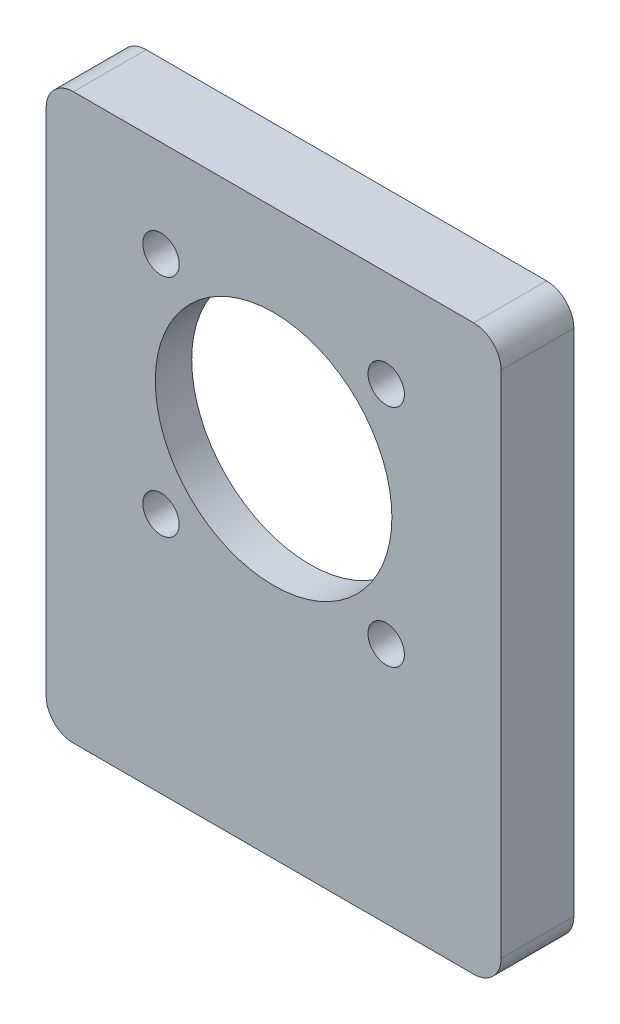
ISO-10303-21;
HEADER;
FILE_DESCRIPTION(('STEP AP214'),'2;1');
FILE_NAME('part.step','',(''),(''),'','','');
FILE_SCHEMA(('AUTOMOTIVE_DESIGN { 1 0 10303 214 1 1 1 1 }'));
ENDSEC;
DATA;
#1=APPLICATION_CONTEXT('core data for automotive mechanical design processes');
#2=APPLICATION_PROTOCOL_DEFINITION('international standard','automotive_design',2000,#1);
#3=PRODUCT_CONTEXT('',#1,'mechanical');
#4=PRODUCT('Part','Part','',(#3));
#5=PRODUCT_RELATED_PRODUCT_CATEGORY('part','',(#4));
#6=PRODUCT_DEFINITION_FORMATION('','',#4);
#7=PRODUCT_DEFINITION_CONTEXT('part definition',#1,'design');
#8=PRODUCT_DEFINITION('design','',#6,#7);
#9=PRODUCT_DEFINITION_SHAPE('','',#8);
#10=(LENGTH_UNIT() NAMED_UNIT(*) SI_UNIT(.MILLI.,.METRE.));
#11=(NAMED_UNIT(*) PLANE_ANGLE_UNIT() SI_UNIT($,.RADIAN.));
#12=(NAMED_UNIT(*) SI_UNIT($,.STERADIAN.) SOLID_ANGLE_UNIT());
#13=UNCERTAINTY_MEASURE_WITH_UNIT(LENGTH_MEASURE(1.E-05),#10,'distance_accuracy_value','');
#14=(GEOMETRIC_REPRESENTATION_CONTEXT(3) GLOBAL_UNCERTAINTY_ASSIGNED_CONTEXT((#13)) GLOBAL_UNIT_ASSIGNED_CONTEXT((#10,
#11,#12)) REPRESENTATION_CONTEXT('',''));
#15=CARTESIAN_POINT('',(0.,0.,0.));
#16=DIRECTION('',(0.,0.,1.));
#17=DIRECTION('',(1.,0.,0.));
#18=AXIS2_PLACEMENT_3D('',#15,#16,#17);
#19=CARTESIAN_POINT('',(0.,8.,0.));
#20=DIRECTION('',(0.,0.,1.));
#21=DIRECTION('',(1.,0.,0.));
#22=AXIS2_PLACEMENT_3D('',#19,#20,#21);
#23=CYLINDRICAL_SURFACE('',#22,13.);
#24=CARTESIAN_POINT('',(0.,8.,8.));
#25=DIRECTION('',(0.,0.,1.));
#26=DIRECTION('',(1.,0.,0.));
#27=AXIS2_PLACEMENT_3D('',#24,#25,#26);
#28=CIRCLE('',#27,13.);
#29=CARTESIAN_POINT('',(13.,8.,8.));
#30=VERTEX_POINT('',#29);
#31=EDGE_CURVE('E152',#30,#30,#28,.T.);
#32=ORIENTED_EDGE('',*,*,#31,.T.);
#33=EDGE_LOOP('',(#32));
#34=FACE_BOUND('',#33,.T.);
#35=CARTESIAN_POINT('',(0.,8.,4.));
#36=DIRECTION('',(0.,0.,-1.));
#37=DIRECTION('',(-1.,0.,0.));
#38=AXIS2_PLACEMENT_3D('',#35,#36,#37);
#39=CIRCLE('',#38,13.);
#40=CARTESIAN_POINT('',(-13.,8.,4.));
#41=VERTEX_POINT('',#40);
#42=EDGE_CURVE('E357',#41,#41,#39,.F.);
#43=ORIENTED_EDGE('',*,*,#42,.F.);
#44=EDGE_LOOP('',(#43));
#45=FACE_BOUND('',#44,.T.);
#46=ADVANCED_FACE('F51',(#34,#45),#23,.F.);
#47=CARTESIAN_POINT('',(12.3743686707647,20.3743686707644,0.));
#48=DIRECTION('',(0.,0.,1.));
#49=DIRECTION('',(1.,0.,0.));
#50=AXIS2_PLACEMENT_3D('',#47,#48,#49);
#51=CYLINDRICAL_SURFACE('',#50,2.00000000000001);
#52=CARTESIAN_POINT('',(12.3743686707647,20.3743686707644,8.));
#53=DIRECTION('',(0.,0.,1.));
#54=DIRECTION('',(1.,0.,0.));
#55=AXIS2_PLACEMENT_3D('',#52,#53,#54);
#56=CIRCLE('',#55,2.00000000000001);
#57=CARTESIAN_POINT('',(14.3743686707647,20.3743686707644,8.));
#58=VERTEX_POINT('',#57);
#59=EDGE_CURVE('E149',#58,#58,#56,.T.);
#60=ORIENTED_EDGE('',*,*,#59,.T.);
#61=EDGE_LOOP('',(#60));
#62=FACE_BOUND('',#61,.T.);
#63=CARTESIAN_POINT('',(12.3743686707647,20.3743686707644,4.));
#64=DIRECTION('',(0.,0.,-1.));
#65=DIRECTION('',(-1.,0.,0.));
#66=AXIS2_PLACEMENT_3D('',#63,#64,#65);
#67=CIRCLE('',#66,2.00000000000001);
#68=CARTESIAN_POINT('',(10.3743686707647,20.3743686707644,4.));
#69=VERTEX_POINT('',#68);
#70=EDGE_CURVE('E351',#69,#69,#67,.F.);
#71=ORIENTED_EDGE('',*,*,#70,.F.);
#72=EDGE_LOOP('',(#71));
#73=FACE_BOUND('',#72,.T.);
#74=ADVANCED_FACE('F237',(#62,#73),#51,.F.);
#75=CARTESIAN_POINT('',(12.3743686707646,-4.37436867076472,0.));
#76=DIRECTION('',(0.,0.,1.));
#77=DIRECTION('',(1.,0.,0.));
#78=AXIS2_PLACEMENT_3D('',#75,#76,#77);
#79=CYLINDRICAL_SURFACE('',#78,2.00000000000001);
#80=CARTESIAN_POINT('',(12.3743686707646,-4.37436867076472,8.));
#81=DIRECTION('',(0.,0.,1.));
#82=DIRECTION('',(1.,0.,0.));
#83=AXIS2_PLACEMENT_3D('',#80,#81,#82);
#84=CIRCLE('',#83,2.00000000000001);
#85=CARTESIAN_POINT('',(14.3743686707646,-4.37436867076472,8.));
#86=VERTEX_POINT('',#85);
#87=EDGE_CURVE('E153',#86,#86,#84,.T.);
#88=ORIENTED_EDGE('',*,*,#87,.T.);
#89=EDGE_LOOP('',(#88));
#90=FACE_BOUND('',#89,.T.);
#91=CARTESIAN_POINT('',(12.3743686707646,-4.37436867076472,4.));
#92=DIRECTION('',(0.,0.,-1.));
#93=DIRECTION('',(-1.,0.,0.));
#94=AXIS2_PLACEMENT_3D('',#91,#92,#93);
#95=CIRCLE('',#94,2.00000000000001);
#96=CARTESIAN_POINT('',(10.3743686707646,-4.37436867076472,4.));
#97=VERTEX_POINT('',#96);
#98=EDGE_CURVE('E348',#97,#97,#95,.F.);
#99=ORIENTED_EDGE('',*,*,#98,.F.);
#100=EDGE_LOOP('',(#99));
#101=FACE_BOUND('',#100,.T.);
#102=ADVANCED_FACE('F244',(#90,#101),#79,.F.);
#103=CARTESIAN_POINT('',(-12.3743686707646,-4.37436867076459,0.));
#104=DIRECTION('',(0.,0.,1.));
#105=DIRECTION('',(1.,0.,0.));
#106=AXIS2_PLACEMENT_3D('',#103,#104,#105);
#107=CYLINDRICAL_SURFACE('',#106,2.00000000000001);
#108=CARTESIAN_POINT('',(-12.3743686707646,-4.37436867076459,8.));
#109=DIRECTION('',(0.,0.,1.));
#110=DIRECTION('',(1.,0.,0.));
#111=AXIS2_PLACEMENT_3D('',#108,#109,#110);
#112=CIRCLE('',#111,2.00000000000001);
#113=CARTESIAN_POINT('',(-10.3743686707646,-4.37436867076459,8.));
#114=VERTEX_POINT('',#113);
#115=EDGE_CURVE('E156',#114,#114,#112,.T.);
#116=ORIENTED_EDGE('',*,*,#115,.T.);
#117=EDGE_LOOP('',(#116));
#118=FACE_BOUND('',#117,.T.);
#119=CARTESIAN_POINT('',(-12.3743686707646,-4.37436867076459,4.));
#120=DIRECTION('',(0.,0.,-1.));
#121=DIRECTION('',(-1.,0.,0.));
#122=AXIS2_PLACEMENT_3D('',#119,#120,#121);
#123=CIRCLE('',#122,2.00000000000001);
#124=CARTESIAN_POINT('',(-14.3743686707646,-4.37436867076459,4.));
#125=VERTEX_POINT('',#124);
#126=EDGE_CURVE('E220',#125,#125,#123,.F.);
#127=ORIENTED_EDGE('',*,*,#126,.F.);
#128=EDGE_LOOP('',(#127));
#129=FACE_BOUND('',#128,.T.);
#130=ADVANCED_FACE('F335',(#118,#129),#107,.F.);
#131=CARTESIAN_POINT('',(-12.3743686707645,20.3743686707646,0.));
#132=DIRECTION('',(0.,0.,1.));
#133=DIRECTION('',(1.,0.,0.));
#134=AXIS2_PLACEMENT_3D('',#131,#132,#133);
#135=CYLINDRICAL_SURFACE('',#134,2.00000000000001);
#136=CARTESIAN_POINT('',(-12.3743686707645,20.3743686707646,8.));
#137=DIRECTION('',(0.,0.,1.));
#138=DIRECTION('',(1.,0.,0.));
#139=AXIS2_PLACEMENT_3D('',#136,#137,#138);
#140=CIRCLE('',#139,2.00000000000001);
#141=CARTESIAN_POINT('',(-10.3743686707644,20.3743686707646,8.));
#142=VERTEX_POINT('',#141);
#143=EDGE_CURVE('E148',#142,#142,#140,.T.);
#144=ORIENTED_EDGE('',*,*,#143,.T.);
#145=EDGE_LOOP('',(#144));
#146=FACE_BOUND('',#145,.T.);
#147=CARTESIAN_POINT('',(-12.3743686707645,20.3743686707646,4.));
#148=DIRECTION('',(0.,0.,-1.));
#149=DIRECTION('',(-1.,0.,0.));
#150=AXIS2_PLACEMENT_3D('',#147,#148,#149);
#151=CIRCLE('',#150,2.00000000000001);
#152=CARTESIAN_POINT('',(-14.3743686707645,20.3743686707646,4.));
#153=VERTEX_POINT('',#152);
#154=EDGE_CURVE('E218',#153,#153,#151,.F.);
#155=ORIENTED_EDGE('',*,*,#154,.F.);
#156=EDGE_LOOP('',(#155));
#157=FACE_BOUND('',#156,.T.);
#158=ADVANCED_FACE('F250',(#146,#157),#135,.F.);
#159=CARTESIAN_POINT('',(25.,31.,8.));
#160=DIRECTION('',(-1.,0.,0.));
#161=DIRECTION('',(0.,-1.,0.));
#162=AXIS2_PLACEMENT_3D('',#159,#160,#161);
#163=PLANE('',#162);
#164=DIRECTION('',(0.,1.,0.));
#165=VECTOR('',#164,1.);
#166=CARTESIAN_POINT('',(25.,31.,8.));
#167=LINE('',#166,#165);
#168=CARTESIAN_POINT('',(25.,-28.,8.));
#169=VERTEX_POINT('',#168);
#170=CARTESIAN_POINT('',(25.,28.,8.));
#171=VERTEX_POINT('',#170);
#172=EDGE_CURVE('E164',#169,#171,#167,.T.);
#173=ORIENTED_EDGE('',*,*,#172,.F.);
#174=DIRECTION('',(0.,0.,-1.));
#175=VECTOR('',#174,1.);
#176=CARTESIAN_POINT('',(25.,-28.,8.));
#177=LINE('',#176,#175);
#178=CARTESIAN_POINT('',(25.,-28.,0.));
#179=VERTEX_POINT('',#178);
#180=EDGE_CURVE('E186',#169,#179,#177,.T.);
#181=ORIENTED_EDGE('',*,*,#180,.T.);
#182=DIRECTION('',(0.,1.,0.));
#183=VECTOR('',#182,1.);
#184=CARTESIAN_POINT('',(25.,31.,0.));
#185=LINE('',#184,#183);
#186=CARTESIAN_POINT('',(25.,28.,0.));
#187=VERTEX_POINT('',#186);
#188=EDGE_CURVE('E163',#179,#187,#185,.T.);
#189=ORIENTED_EDGE('',*,*,#188,.T.);
#190=DIRECTION('',(0.,0.,-1.));
#191=VECTOR('',#190,1.);
#192=CARTESIAN_POINT('',(25.,28.,8.));
#193=LINE('',#192,#191);
#194=EDGE_CURVE('E175',#187,#171,#193,.F.);
#195=ORIENTED_EDGE('',*,*,#194,.T.);
#196=EDGE_LOOP('',(#173,#181,#189,#195));
#197=FACE_BOUND('',#196,.T.);
#198=ADVANCED_FACE('F271',(#197),#163,.F.);
#199=CARTESIAN_POINT('',(-25.,31.,8.));
#200=DIRECTION('',(0.,-1.,0.));
#201=DIRECTION('',(0.,0.,-1.));
#202=AXIS2_PLACEMENT_3D('',#199,#200,#201);
#203=PLANE('',#202);
#204=DIRECTION('',(-1.,0.,0.));
#205=VECTOR('',#204,1.);
#206=CARTESIAN_POINT('',(-25.,31.,0.));
#207=LINE('',#206,#205);
#208=CARTESIAN_POINT('',(22.,31.,0.));
#209=VERTEX_POINT('',#208);
#210=CARTESIAN_POINT('',(-22.,31.,0.));
#211=VERTEX_POINT('',#210);
#212=EDGE_CURVE('E178',#209,#211,#207,.T.);
#213=ORIENTED_EDGE('',*,*,#212,.T.);
#214=DIRECTION('',(0.,0.,-1.));
#215=VECTOR('',#214,1.);
#216=CARTESIAN_POINT('',(-22.,31.,8.));
#217=LINE('',#216,#215);
#218=CARTESIAN_POINT('',(-22.,31.,8.));
#219=VERTEX_POINT('',#218);
#220=EDGE_CURVE('E216',#211,#219,#217,.F.);
#221=ORIENTED_EDGE('',*,*,#220,.T.);
#222=DIRECTION('',(-1.,0.,0.));
#223=VECTOR('',#222,1.);
#224=CARTESIAN_POINT('',(-25.,31.,8.));
#225=LINE('',#224,#223);
#226=CARTESIAN_POINT('',(22.,31.,8.));
#227=VERTEX_POINT('',#226);
#228=EDGE_CURVE('E167',#227,#219,#225,.T.);
#229=ORIENTED_EDGE('',*,*,#228,.F.);
#230=DIRECTION('',(0.,0.,-1.));
#231=VECTOR('',#230,1.);
#232=CARTESIAN_POINT('',(22.,31.,8.));
#233=LINE('',#232,#231);
#234=EDGE_CURVE('E213',#227,#209,#233,.T.);
#235=ORIENTED_EDGE('',*,*,#234,.T.);
#236=EDGE_LOOP('',(#213,#221,#229,#235));
#237=FACE_BOUND('',#236,.T.);
#238=ADVANCED_FACE('F268',(#237),#203,.F.);
#239=CARTESIAN_POINT('',(-25.,31.,8.));
#240=DIRECTION('',(1.,0.,0.));
#241=DIRECTION('',(0.,1.,0.));
#242=AXIS2_PLACEMENT_3D('',#239,#240,#241);
#243=PLANE('',#242);
#244=DIRECTION('',(0.,-1.,0.));
#245=VECTOR('',#244,1.);
#246=CARTESIAN_POINT('',(-25.,31.,8.));
#247=LINE('',#246,#245);
#248=CARTESIAN_POINT('',(-25.,28.,8.));
#249=VERTEX_POINT('',#248);
#250=CARTESIAN_POINT('',(-25.,-28.,8.));
#251=VERTEX_POINT('',#250);
#252=EDGE_CURVE('E170',#249,#251,#247,.T.);
#253=ORIENTED_EDGE('',*,*,#252,.F.);
#254=DIRECTION('',(0.,0.,-1.));
#255=VECTOR('',#254,1.);
#256=CARTESIAN_POINT('',(-25.,28.,8.));
#257=LINE('',#256,#255);
#258=CARTESIAN_POINT('',(-25.,28.,0.));
#259=VERTEX_POINT('',#258);
#260=EDGE_CURVE('E210',#249,#259,#257,.T.);
#261=ORIENTED_EDGE('',*,*,#260,.T.);
#262=DIRECTION('',(0.,-1.,0.));
#263=VECTOR('',#262,1.);
#264=CARTESIAN_POINT('',(-25.,31.,0.));
#265=LINE('',#264,#263);
#266=CARTESIAN_POINT('',(-25.,-28.,0.));
#267=VERTEX_POINT('',#266);
#268=EDGE_CURVE('E181',#259,#267,#265,.T.);
#269=ORIENTED_EDGE('',*,*,#268,.T.);
#270=DIRECTION('',(0.,0.,-1.));
#271=VECTOR('',#270,1.);
#272=CARTESIAN_POINT('',(-25.,-28.,8.));
#273=LINE('',#272,#271);
#274=EDGE_CURVE('E66',#267,#251,#273,.F.);
#275=ORIENTED_EDGE('',*,*,#274,.T.);
#276=EDGE_LOOP('',(#253,#261,#269,#275));
#277=FACE_BOUND('',#276,.T.);
#278=ADVANCED_FACE('F264',(#277),#243,.F.);
#279=CARTESIAN_POINT('',(-25.,-31.,8.));
#280=DIRECTION('',(0.,1.,0.));
#281=DIRECTION('',(0.,0.,1.));
#282=AXIS2_PLACEMENT_3D('',#279,#280,#281);
#283=PLANE('',#282);
#284=CARTESIAN_POINT('',(-15.,-31.,3.99999999999999));
#285=DIRECTION('',(0.,-1.,0.));
#286=DIRECTION('',(0.,0.,-1.));
#287=AXIS2_PLACEMENT_3D('',#284,#285,#286);
#288=CIRCLE('',#287,2.525);
#289=CARTESIAN_POINT('',(-15.,-31.,1.475));
#290=VERTEX_POINT('',#289);
#291=EDGE_CURVE('E139',#290,#290,#288,.T.);
#292=ORIENTED_EDGE('',*,*,#291,.F.);
#293=EDGE_LOOP('',(#292));
#294=FACE_BOUND('',#293,.T.);
#295=CARTESIAN_POINT('',(15.,-31.,4.));
#296=DIRECTION('',(0.,-1.,0.));
#297=DIRECTION('',(0.,0.,-1.));
#298=AXIS2_PLACEMENT_3D('',#295,#296,#297);
#299=CIRCLE('',#298,2.525);
#300=CARTESIAN_POINT('',(15.,-31.,1.475));
#301=VERTEX_POINT('',#300);
#302=EDGE_CURVE('E132',#301,#301,#299,.T.);
#303=ORIENTED_EDGE('',*,*,#302,.F.);
#304=EDGE_LOOP('',(#303));
#305=FACE_BOUND('',#304,.T.);
#306=DIRECTION('',(1.,0.,0.));
#307=VECTOR('',#306,1.);
#308=CARTESIAN_POINT('',(-25.,-31.,0.));
#309=LINE('',#308,#307);
#310=CARTESIAN_POINT('',(-22.,-31.,0.));
#311=VERTEX_POINT('',#310);
#312=CARTESIAN_POINT('',(22.,-31.,0.));
#313=VERTEX_POINT('',#312);
#314=EDGE_CURVE('E168',#311,#313,#309,.T.);
#315=ORIENTED_EDGE('',*,*,#314,.T.);
#316=DIRECTION('',(0.,0.,-1.));
#317=VECTOR('',#316,1.);
#318=CARTESIAN_POINT('',(22.,-31.,8.));
#319=LINE('',#318,#317);
#320=CARTESIAN_POINT('',(22.,-31.,8.));
#321=VERTEX_POINT('',#320);
#322=EDGE_CURVE('E200',#313,#321,#319,.F.);
#323=ORIENTED_EDGE('',*,*,#322,.T.);
#324=DIRECTION('',(1.,0.,0.));
#325=VECTOR('',#324,1.);
#326=CARTESIAN_POINT('',(-25.,-31.,8.));
#327=LINE('',#326,#325);
#328=CARTESIAN_POINT('',(-22.,-31.,8.));
#329=VERTEX_POINT('',#328);
#330=EDGE_CURVE('E172',#329,#321,#327,.T.);
#331=ORIENTED_EDGE('',*,*,#330,.F.);
#332=DIRECTION('',(0.,0.,-1.));
#333=VECTOR('',#332,1.);
#334=CARTESIAN_POINT('',(-22.,-31.,8.));
#335=LINE('',#334,#333);
#336=EDGE_CURVE('E197',#329,#311,#335,.T.);
#337=ORIENTED_EDGE('',*,*,#336,.T.);
#338=EDGE_LOOP('',(#315,#323,#331,#337));
#339=FACE_BOUND('',#338,.T.);
#340=ADVANCED_FACE('F256',(#294,#305,#339),#283,.F.);
#341=CARTESIAN_POINT('',(0.,0.,8.));
#342=DIRECTION('',(0.,0.,1.));
#343=DIRECTION('',(1.,0.,0.));
#344=AXIS2_PLACEMENT_3D('',#341,#342,#343);
#345=PLANE('',#344);
#346=ORIENTED_EDGE('',*,*,#143,.F.);
#347=EDGE_LOOP('',(#346));
#348=FACE_BOUND('',#347,.T.);
#349=ORIENTED_EDGE('',*,*,#115,.F.);
#350=EDGE_LOOP('',(#349));
#351=FACE_BOUND('',#350,.T.);
#352=ORIENTED_EDGE('',*,*,#87,.F.);
#353=EDGE_LOOP('',(#352));
#354=FACE_BOUND('',#353,.T.);
#355=ORIENTED_EDGE('',*,*,#59,.F.);
#356=EDGE_LOOP('',(#355));
#357=FACE_BOUND('',#356,.T.);
#358=ORIENTED_EDGE('',*,*,#31,.F.);
#359=EDGE_LOOP('',(#358));
#360=FACE_BOUND('',#359,.T.);
#361=ORIENTED_EDGE('',*,*,#330,.T.);
#362=CARTESIAN_POINT('',(22.,-28.,8.));
#363=DIRECTION('',(0.,0.,1.));
#364=DIRECTION('',(1.,0.,0.));
#365=AXIS2_PLACEMENT_3D('',#362,#363,#364);
#366=CIRCLE('',#365,3.);
#367=EDGE_CURVE('E207',#321,#169,#366,.T.);
#368=ORIENTED_EDGE('',*,*,#367,.T.);
#369=ORIENTED_EDGE('',*,*,#172,.T.);
#370=CARTESIAN_POINT('',(22.,28.,8.));
#371=DIRECTION('',(0.,0.,1.));
#372=DIRECTION('',(1.,0.,0.));
#373=AXIS2_PLACEMENT_3D('',#370,#371,#372);
#374=CIRCLE('',#373,3.);
#375=EDGE_CURVE('E204',#171,#227,#374,.T.);
#376=ORIENTED_EDGE('',*,*,#375,.T.);
#377=ORIENTED_EDGE('',*,*,#228,.T.);
#378=CARTESIAN_POINT('',(-22.,28.,8.));
#379=DIRECTION('',(0.,0.,1.));
#380=DIRECTION('',(1.,0.,0.));
#381=AXIS2_PLACEMENT_3D('',#378,#379,#380);
#382=CIRCLE('',#381,3.);
#383=EDGE_CURVE('E73',#219,#249,#382,.T.);
#384=ORIENTED_EDGE('',*,*,#383,.T.);
#385=ORIENTED_EDGE('',*,*,#252,.T.);
#386=CARTESIAN_POINT('',(-22.,-28.,8.));
#387=DIRECTION('',(0.,0.,1.));
#388=DIRECTION('',(1.,0.,0.));
#389=AXIS2_PLACEMENT_3D('',#386,#387,#388);
#390=CIRCLE('',#389,3.);
#391=EDGE_CURVE('E202',#251,#329,#390,.T.);
#392=ORIENTED_EDGE('',*,*,#391,.T.);
#393=EDGE_LOOP('',(#361,#368,#369,#376,#377,#384,#385,#392));
#394=FACE_BOUND('',#393,.T.);
#395=ADVANCED_FACE('F252',(#348,#351,#354,#357,#360,#394),#345,.T.);
#396=CARTESIAN_POINT('',(0.,0.,0.));
#397=DIRECTION('',(0.,0.,1.));
#398=DIRECTION('',(1.,0.,0.));
#399=AXIS2_PLACEMENT_3D('',#396,#397,#398);
#400=PLANE('',#399);
#401=CARTESIAN_POINT('',(0.,8.,0.));
#402=DIRECTION('',(0.,0.,1.));
#403=DIRECTION('',(1.,0.,0.));
#404=AXIS2_PLACEMENT_3D('',#401,#402,#403);
#405=CIRCLE('',#404,21.75);
#406=CARTESIAN_POINT('',(21.75,8.,0.));
#407=VERTEX_POINT('',#406);
#408=EDGE_CURVE('E13',#407,#407,#405,.T.);
#409=ORIENTED_EDGE('',*,*,#408,.T.);
#410=EDGE_LOOP('',(#409));
#411=FACE_BOUND('',#410,.T.);
#412=ORIENTED_EDGE('',*,*,#188,.F.);
#413=CARTESIAN_POINT('',(22.,-28.,0.));
#414=DIRECTION('',(0.,0.,1.));
#415=DIRECTION('',(1.,0.,0.));
#416=AXIS2_PLACEMENT_3D('',#413,#414,#415);
#417=CIRCLE('',#416,3.);
#418=EDGE_CURVE('E195',#179,#313,#417,.F.);
#419=ORIENTED_EDGE('',*,*,#418,.T.);
#420=ORIENTED_EDGE('',*,*,#314,.F.);
#421=CARTESIAN_POINT('',(-22.,-28.,0.));
#422=DIRECTION('',(0.,0.,1.));
#423=DIRECTION('',(1.,0.,0.));
#424=AXIS2_PLACEMENT_3D('',#421,#422,#423);
#425=CIRCLE('',#424,3.);
#426=EDGE_CURVE('E189',#311,#267,#425,.F.);
#427=ORIENTED_EDGE('',*,*,#426,.T.);
#428=ORIENTED_EDGE('',*,*,#268,.F.);
#429=CARTESIAN_POINT('',(-22.,28.,0.));
#430=DIRECTION('',(0.,0.,1.));
#431=DIRECTION('',(1.,0.,0.));
#432=AXIS2_PLACEMENT_3D('',#429,#430,#431);
#433=CIRCLE('',#432,3.);
#434=EDGE_CURVE('E193',#259,#211,#433,.F.);
#435=ORIENTED_EDGE('',*,*,#434,.T.);
#436=ORIENTED_EDGE('',*,*,#212,.F.);
#437=CARTESIAN_POINT('',(22.,28.,0.));
#438=DIRECTION('',(0.,0.,1.));
#439=DIRECTION('',(1.,0.,0.));
#440=AXIS2_PLACEMENT_3D('',#437,#438,#439);
#441=CIRCLE('',#440,3.);
#442=EDGE_CURVE('E191',#209,#187,#441,.F.);
#443=ORIENTED_EDGE('',*,*,#442,.T.);
#444=EDGE_LOOP('',(#412,#419,#420,#427,#428,#435,#436,#443));
#445=FACE_BOUND('',#444,.T.);
#446=ADVANCED_FACE('F255',(#411,#445),#400,.F.);
#447=CARTESIAN_POINT('',(15.,-16.,4.));
#448=DIRECTION('',(0.,-1.,0.));
#449=DIRECTION('',(0.,0.,-1.));
#450=AXIS2_PLACEMENT_3D('',#447,#448,#449);
#451=CONICAL_SURFACE('',#450,2.1,1.02974425867665);
#452=CARTESIAN_POINT('',(15.,-14.7381927000421,4.));
#453=VERTEX_POINT('',#452);
#454=VERTEX_LOOP('',#453);
#455=FACE_BOUND('',#454,.T.);
#456=CARTESIAN_POINT('',(15.,-16.,4.));
#457=DIRECTION('',(0.,-1.,0.));
#458=DIRECTION('',(0.,0.,-1.));
#459=AXIS2_PLACEMENT_3D('',#456,#457,#458);
#460=CIRCLE('',#459,2.1);
#461=CARTESIAN_POINT('',(15.,-16.,1.90000000000001));
#462=VERTEX_POINT('',#461);
#463=EDGE_CURVE('E145',#462,#462,#460,.T.);
#464=ORIENTED_EDGE('',*,*,#463,.T.);
#465=EDGE_LOOP('',(#464));
#466=FACE_BOUND('',#465,.T.);
#467=ADVANCED_FACE('F260',(#455,#466),#451,.F.);
#468=CARTESIAN_POINT('',(15.,-31.,4.));
#469=DIRECTION('',(0.,-1.,0.));
#470=DIRECTION('',(0.,0.,-1.));
#471=AXIS2_PLACEMENT_3D('',#468,#469,#470);
#472=CYLINDRICAL_SURFACE('',#471,2.1);
#473=ORIENTED_EDGE('',*,*,#463,.F.);
#474=EDGE_LOOP('',(#473));
#475=FACE_BOUND('',#474,.T.);
#476=CARTESIAN_POINT('',(15.,-30.575,4.));
#477=DIRECTION('',(0.,-1.,0.));
#478=DIRECTION('',(0.,0.,-1.));
#479=AXIS2_PLACEMENT_3D('',#476,#477,#478);
#480=CIRCLE('',#479,2.1);
#481=CARTESIAN_POINT('',(15.,-30.575,1.9));
#482=VERTEX_POINT('',#481);
#483=EDGE_CURVE('E136',#482,#482,#480,.T.);
#484=ORIENTED_EDGE('',*,*,#483,.T.);
#485=EDGE_LOOP('',(#484));
#486=FACE_BOUND('',#485,.T.);
#487=ADVANCED_FACE('F326',(#475,#486),#472,.F.);
#488=CARTESIAN_POINT('',(15.,-31.,4.));
#489=DIRECTION('',(0.,-1.,0.));
#490=DIRECTION('',(0.,0.,-1.));
#491=AXIS2_PLACEMENT_3D('',#488,#489,#490);
#492=CONICAL_SURFACE('',#491,2.525,0.785398163397448);
#493=ORIENTED_EDGE('',*,*,#483,.F.);
#494=EDGE_LOOP('',(#493));
#495=FACE_BOUND('',#494,.T.);
#496=ORIENTED_EDGE('',*,*,#302,.T.);
#497=EDGE_LOOP('',(#496));
#498=FACE_BOUND('',#497,.T.);
#499=ADVANCED_FACE('F126',(#495,#498),#492,.F.);
#500=CARTESIAN_POINT('',(-15.,-16.,3.99999999999999));
#501=DIRECTION('',(0.,-1.,0.));
#502=DIRECTION('',(0.,0.,-1.));
#503=AXIS2_PLACEMENT_3D('',#500,#501,#502);
#504=CONICAL_SURFACE('',#503,2.1,1.02974425867665);
#505=CARTESIAN_POINT('',(-15.,-14.7381927000421,3.99999999999999));
#506=VERTEX_POINT('',#505);
#507=VERTEX_LOOP('',#506);
#508=FACE_BOUND('',#507,.T.);
#509=CARTESIAN_POINT('',(-15.,-16.,3.99999999999999));
#510=DIRECTION('',(0.,-1.,0.));
#511=DIRECTION('',(0.,0.,-1.));
#512=AXIS2_PLACEMENT_3D('',#509,#510,#511);
#513=CIRCLE('',#512,2.1);
#514=CARTESIAN_POINT('',(-15.,-16.,1.9));
#515=VERTEX_POINT('',#514);
#516=EDGE_CURVE('E130',#515,#515,#513,.T.);
#517=ORIENTED_EDGE('',*,*,#516,.T.);
#518=EDGE_LOOP('',(#517));
#519=FACE_BOUND('',#518,.T.);
#520=ADVANCED_FACE('F122',(#508,#519),#504,.F.);
#521=CARTESIAN_POINT('',(-15.,-31.,3.99999999999999));
#522=DIRECTION('',(0.,-1.,0.));
#523=DIRECTION('',(0.,0.,-1.));
#524=AXIS2_PLACEMENT_3D('',#521,#522,#523);
#525=CYLINDRICAL_SURFACE('',#524,2.1);
#526=ORIENTED_EDGE('',*,*,#516,.F.);
#527=EDGE_LOOP('',(#526));
#528=FACE_BOUND('',#527,.T.);
#529=CARTESIAN_POINT('',(-15.,-30.575,3.99999999999999));
#530=DIRECTION('',(0.,-1.,0.));
#531=DIRECTION('',(0.,0.,-1.));
#532=AXIS2_PLACEMENT_3D('',#529,#530,#531);
#533=CIRCLE('',#532,2.1);
#534=CARTESIAN_POINT('',(-15.,-30.575,1.9));
#535=VERTEX_POINT('',#534);
#536=EDGE_CURVE('E133',#535,#535,#533,.T.);
#537=ORIENTED_EDGE('',*,*,#536,.T.);
#538=EDGE_LOOP('',(#537));
#539=FACE_BOUND('',#538,.T.);
#540=ADVANCED_FACE('F125',(#528,#539),#525,.F.);
#541=CARTESIAN_POINT('',(-15.,-31.,3.99999999999999));
#542=DIRECTION('',(0.,-1.,0.));
#543=DIRECTION('',(0.,0.,-1.));
#544=AXIS2_PLACEMENT_3D('',#541,#542,#543);
#545=CONICAL_SURFACE('',#544,2.525,0.785398163397446);
#546=ORIENTED_EDGE('',*,*,#536,.F.);
#547=EDGE_LOOP('',(#546));
#548=FACE_BOUND('',#547,.T.);
#549=ORIENTED_EDGE('',*,*,#291,.T.);
#550=EDGE_LOOP('',(#549));
#551=FACE_BOUND('',#550,.T.);
#552=ADVANCED_FACE('F280',(#548,#551),#545,.F.);
#553=CARTESIAN_POINT('',(22.,-28.,8.));
#554=DIRECTION('',(0.,0.,-1.));
#555=DIRECTION('',(-1.,0.,0.));
#556=AXIS2_PLACEMENT_3D('',#553,#554,#555);
#557=CYLINDRICAL_SURFACE('',#556,3.);
#558=ORIENTED_EDGE('',*,*,#367,.F.);
#559=ORIENTED_EDGE('',*,*,#322,.F.);
#560=ORIENTED_EDGE('',*,*,#418,.F.);
#561=ORIENTED_EDGE('',*,*,#180,.F.);
#562=EDGE_LOOP('',(#558,#559,#560,#561));
#563=FACE_BOUND('',#562,.T.);
#564=ADVANCED_FACE('F276',(#563),#557,.T.);
#565=CARTESIAN_POINT('',(-22.,28.,8.));
#566=DIRECTION('',(0.,0.,-1.));
#567=DIRECTION('',(-1.,0.,0.));
#568=AXIS2_PLACEMENT_3D('',#565,#566,#567);
#569=CYLINDRICAL_SURFACE('',#568,3.);
#570=ORIENTED_EDGE('',*,*,#383,.F.);
#571=ORIENTED_EDGE('',*,*,#220,.F.);
#572=ORIENTED_EDGE('',*,*,#434,.F.);
#573=ORIENTED_EDGE('',*,*,#260,.F.);
#574=EDGE_LOOP('',(#570,#571,#572,#573));
#575=FACE_BOUND('',#574,.T.);
#576=ADVANCED_FACE('F279',(#575),#569,.T.);
#577=CARTESIAN_POINT('',(22.,28.,8.));
#578=DIRECTION('',(0.,0.,-1.));
#579=DIRECTION('',(-1.,0.,0.));
#580=AXIS2_PLACEMENT_3D('',#577,#578,#579);
#581=CYLINDRICAL_SURFACE('',#580,3.);
#582=ORIENTED_EDGE('',*,*,#375,.F.);
#583=ORIENTED_EDGE('',*,*,#194,.F.);
#584=ORIENTED_EDGE('',*,*,#442,.F.);
#585=ORIENTED_EDGE('',*,*,#234,.F.);
#586=EDGE_LOOP('',(#582,#583,#584,#585));
#587=FACE_BOUND('',#586,.T.);
#588=ADVANCED_FACE('F284',(#587),#581,.T.);
#589=CARTESIAN_POINT('',(-22.,-28.,8.));
#590=DIRECTION('',(0.,0.,-1.));
#591=DIRECTION('',(-1.,0.,0.));
#592=AXIS2_PLACEMENT_3D('',#589,#590,#591);
#593=CYLINDRICAL_SURFACE('',#592,3.);
#594=ORIENTED_EDGE('',*,*,#391,.F.);
#595=ORIENTED_EDGE('',*,*,#274,.F.);
#596=ORIENTED_EDGE('',*,*,#426,.F.);
#597=ORIENTED_EDGE('',*,*,#336,.F.);
#598=EDGE_LOOP('',(#594,#595,#596,#597));
#599=FACE_BOUND('',#598,.T.);
#600=ADVANCED_FACE('F287',(#599),#593,.T.);
#601=CARTESIAN_POINT('',(0.,8.,4.));
#602=DIRECTION('',(0.,0.,-1.));
#603=DIRECTION('',(-1.,0.,0.));
#604=AXIS2_PLACEMENT_3D('',#601,#602,#603);
#605=PLANE('',#604);
#606=CARTESIAN_POINT('',(0.,8.,4.));
#607=DIRECTION('',(0.,0.,-1.));
#608=DIRECTION('',(-1.,0.,0.));
#609=AXIS2_PLACEMENT_3D('',#606,#607,#608);
#610=CIRCLE('',#609,21.25);
#611=CARTESIAN_POINT('',(-21.25,8.,4.));
#612=VERTEX_POINT('',#611);
#613=EDGE_CURVE('E221',#612,#612,#610,.T.);
#614=ORIENTED_EDGE('',*,*,#613,.T.);
#615=EDGE_LOOP('',(#614));
#616=FACE_BOUND('',#615,.T.);
#617=ORIENTED_EDGE('',*,*,#154,.T.);
#618=EDGE_LOOP('',(#617));
#619=FACE_BOUND('',#618,.T.);
#620=ORIENTED_EDGE('',*,*,#126,.T.);
#621=EDGE_LOOP('',(#620));
#622=FACE_BOUND('',#621,.T.);
#623=ORIENTED_EDGE('',*,*,#98,.T.);
#624=EDGE_LOOP('',(#623));
#625=FACE_BOUND('',#624,.T.);
#626=ORIENTED_EDGE('',*,*,#70,.T.);
#627=EDGE_LOOP('',(#626));
#628=FACE_BOUND('',#627,.T.);
#629=ORIENTED_EDGE('',*,*,#42,.T.);
#630=EDGE_LOOP('',(#629));
#631=FACE_BOUND('',#630,.T.);
#632=ADVANCED_FACE('F233',(#616,#619,#622,#625,#628,#631),#605,.T.);
#633=CARTESIAN_POINT('',(0.,8.,4.));
#634=DIRECTION('',(0.,0.,-1.));
#635=DIRECTION('',(-1.,0.,0.));
#636=AXIS2_PLACEMENT_3D('',#633,#634,#635);
#637=CYLINDRICAL_SURFACE('',#636,21.25);
#638=CARTESIAN_POINT('',(0.,8.,0.500000000000004));
#639=DIRECTION('',(0.,0.,1.));
#640=DIRECTION('',(1.,0.,0.));
#641=AXIS2_PLACEMENT_3D('',#638,#639,#640);
#642=CIRCLE('',#641,21.25);
#643=CARTESIAN_POINT('',(21.25,8.,0.500000000000004));
#644=VERTEX_POINT('',#643);
#645=EDGE_CURVE('E59',#644,#644,#642,.F.);
#646=ORIENTED_EDGE('',*,*,#645,.T.);
#647=EDGE_LOOP('',(#646));
#648=FACE_BOUND('',#647,.T.);
#649=ORIENTED_EDGE('',*,*,#613,.F.);
#650=EDGE_LOOP('',(#649));
#651=FACE_BOUND('',#650,.T.);
#652=ADVANCED_FACE('F225',(#648,#651),#637,.F.);
#653=CARTESIAN_POINT('',(0.,8.,0.500000000000004));
#654=DIRECTION('',(0.,0.,-1.));
#655=DIRECTION('',(-1.,0.,0.));
#656=AXIS2_PLACEMENT_3D('',#653,#654,#655);
#657=CONICAL_SURFACE('',#656,21.25,0.785398163397445);
#658=ORIENTED_EDGE('',*,*,#408,.F.);
#659=EDGE_LOOP('',(#658));
#660=FACE_BOUND('',#659,.T.);
#661=ORIENTED_EDGE('',*,*,#645,.F.);
#662=EDGE_LOOP('',(#661));
#663=FACE_BOUND('',#662,.T.);
#664=ADVANCED_FACE('F53',(#660,#663),#657,.F.);
#665=CLOSED_SHELL('',(#46,#74,#102,#130,#158,#198,#238,#278,#340,#395,#446,#467,#487,#499,#520,
#540,#552,#564,#576,#588,#600,#632,#652,#664));
#666=MANIFOLD_SOLID_BREP('B2',#665);
#667=ADVANCED_BREP_SHAPE_REPRESENTATION('',(#18,#666),#14);
#668=SHAPE_DEFINITION_REPRESENTATION(#9,#667);
ENDSEC;
END-ISO-10303-21;
